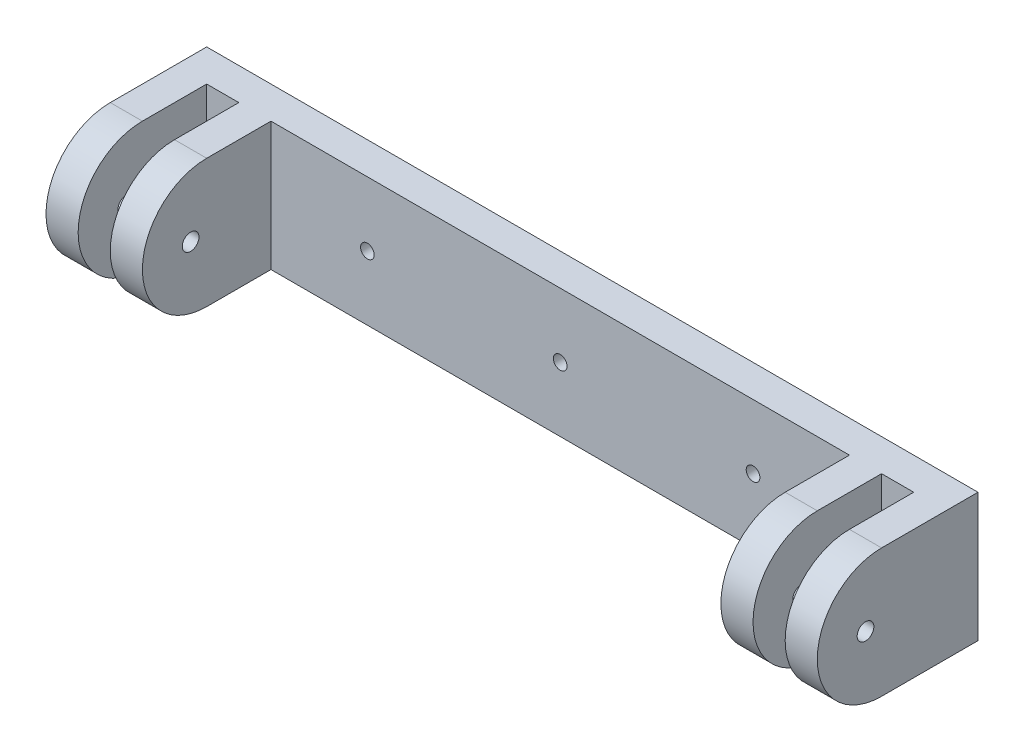
ISO-10303-21;
HEADER;
FILE_DESCRIPTION(('STEP AP214'),'2;1');
FILE_NAME('part.step','',(''),(''),'','','');
FILE_SCHEMA(('AUTOMOTIVE_DESIGN { 1 0 10303 214 1 1 1 1 }'));
ENDSEC;
DATA;
#1=APPLICATION_CONTEXT('core data for automotive mechanical design processes');
#2=APPLICATION_PROTOCOL_DEFINITION('international standard','automotive_design',2000,#1);
#3=PRODUCT_CONTEXT('',#1,'mechanical');
#4=PRODUCT('Part','Part','',(#3));
#5=PRODUCT_RELATED_PRODUCT_CATEGORY('part','',(#4));
#6=PRODUCT_DEFINITION_FORMATION('','',#4);
#7=PRODUCT_DEFINITION_CONTEXT('part definition',#1,'design');
#8=PRODUCT_DEFINITION('design','',#6,#7);
#9=PRODUCT_DEFINITION_SHAPE('','',#8);
#10=(LENGTH_UNIT() NAMED_UNIT(*) SI_UNIT(.MILLI.,.METRE.));
#11=(NAMED_UNIT(*) PLANE_ANGLE_UNIT() SI_UNIT($,.RADIAN.));
#12=(NAMED_UNIT(*) SI_UNIT($,.STERADIAN.) SOLID_ANGLE_UNIT());
#13=UNCERTAINTY_MEASURE_WITH_UNIT(LENGTH_MEASURE(1.E-05),#10,'distance_accuracy_value','');
#14=(GEOMETRIC_REPRESENTATION_CONTEXT(3) GLOBAL_UNCERTAINTY_ASSIGNED_CONTEXT((#13)) GLOBAL_UNIT_ASSIGNED_CONTEXT((#10,
#11,#12)) REPRESENTATION_CONTEXT('',''));
#15=CARTESIAN_POINT('',(0.,0.,0.));
#16=DIRECTION('',(0.,0.,1.));
#17=DIRECTION('',(1.,0.,0.));
#18=AXIS2_PLACEMENT_3D('',#15,#16,#17);
#19=CARTESIAN_POINT('',(-56.5685424949238,20.,30.));
#20=DIRECTION('',(1.,0.,0.));
#21=DIRECTION('',(0.,0.,-1.));
#22=AXIS2_PLACEMENT_3D('',#19,#20,#21);
#23=CYLINDRICAL_SURFACE('',#22,20.);
#24=CARTESIAN_POINT('',(9.99999999999999,20.,30.));
#25=DIRECTION('',(-1.,0.,0.));
#26=DIRECTION('',(0.,0.,1.));
#27=AXIS2_PLACEMENT_3D('',#24,#25,#26);
#28=CIRCLE('',#27,20.);
#29=CARTESIAN_POINT('',(9.99999999999999,40.,30.));
#30=VERTEX_POINT('',#29);
#31=CARTESIAN_POINT('',(10.,0.,30.));
#32=VERTEX_POINT('',#31);
#33=EDGE_CURVE('E182',#30,#32,#28,.F.);
#34=ORIENTED_EDGE('',*,*,#33,.F.);
#35=DIRECTION('',(1.,0.,0.));
#36=VECTOR('',#35,1.);
#37=CARTESIAN_POINT('',(-56.5685424949238,40.,30.));
#38=LINE('',#37,#36);
#39=CARTESIAN_POINT('',(0.,40.,30.));
#40=VERTEX_POINT('',#39);
#41=EDGE_CURVE('E297',#40,#30,#38,.T.);
#42=ORIENTED_EDGE('',*,*,#41,.F.);
#43=CARTESIAN_POINT('',(0.,20.,30.));
#44=DIRECTION('',(1.,0.,0.));
#45=DIRECTION('',(0.,0.,-1.));
#46=AXIS2_PLACEMENT_3D('',#43,#44,#45);
#47=CIRCLE('',#46,20.);
#48=CARTESIAN_POINT('',(0.,0.,30.));
#49=VERTEX_POINT('',#48);
#50=EDGE_CURVE('E294',#49,#40,#47,.F.);
#51=ORIENTED_EDGE('',*,*,#50,.F.);
#52=DIRECTION('',(1.,0.,0.));
#53=VECTOR('',#52,1.);
#54=CARTESIAN_POINT('',(-56.5685424949238,0.,30.));
#55=LINE('',#54,#53);
#56=EDGE_CURVE('E291',#49,#32,#55,.T.);
#57=ORIENTED_EDGE('',*,*,#56,.T.);
#58=EDGE_LOOP('',(#34,#42,#51,#57));
#59=FACE_BOUND('',#58,.T.);
#60=ADVANCED_FACE('F47',(#59),#23,.T.);
#61=CARTESIAN_POINT('',(20.,20.,30.));
#62=DIRECTION('',(1.,0.,0.));
#63=DIRECTION('',(0.,0.,-1.));
#64=AXIS2_PLACEMENT_3D('',#61,#62,#63);
#65=CIRCLE('',#64,20.);
#66=CARTESIAN_POINT('',(20.,0.,30.));
#67=VERTEX_POINT('',#66);
#68=CARTESIAN_POINT('',(20.,40.,30.));
#69=VERTEX_POINT('',#68);
#70=EDGE_CURVE('E265',#67,#69,#65,.F.);
#71=ORIENTED_EDGE('',*,*,#70,.F.);
#72=CARTESIAN_POINT('',(30.,0.,30.));
#73=VERTEX_POINT('',#72);
#74=EDGE_CURVE('E295',#67,#73,#55,.T.);
#75=ORIENTED_EDGE('',*,*,#74,.T.);
#76=CARTESIAN_POINT('',(30.,20.,30.));
#77=DIRECTION('',(-1.,0.,0.));
#78=DIRECTION('',(0.,0.,1.));
#79=AXIS2_PLACEMENT_3D('',#76,#77,#78);
#80=CIRCLE('',#79,20.);
#81=CARTESIAN_POINT('',(30.,40.,30.));
#82=VERTEX_POINT('',#81);
#83=EDGE_CURVE('E257',#82,#73,#80,.F.);
#84=ORIENTED_EDGE('',*,*,#83,.F.);
#85=EDGE_CURVE('E301',#69,#82,#38,.T.);
#86=ORIENTED_EDGE('',*,*,#85,.F.);
#87=EDGE_LOOP('',(#71,#75,#84,#86));
#88=FACE_BOUND('',#87,.T.);
#89=ADVANCED_FACE('F382',(#88),#23,.T.);
#90=CARTESIAN_POINT('',(210.,20.,30.));
#91=DIRECTION('',(1.,0.,0.));
#92=DIRECTION('',(0.,0.,-1.));
#93=AXIS2_PLACEMENT_3D('',#90,#91,#92);
#94=CIRCLE('',#93,20.);
#95=CARTESIAN_POINT('',(210.,0.,30.));
#96=VERTEX_POINT('',#95);
#97=CARTESIAN_POINT('',(210.,40.,30.));
#98=VERTEX_POINT('',#97);
#99=EDGE_CURVE('E249',#96,#98,#94,.F.);
#100=ORIENTED_EDGE('',*,*,#99,.F.);
#101=CARTESIAN_POINT('',(220.,0.,30.));
#102=VERTEX_POINT('',#101);
#103=EDGE_CURVE('E421',#96,#102,#55,.T.);
#104=ORIENTED_EDGE('',*,*,#103,.T.);
#105=CARTESIAN_POINT('',(220.,20.,30.));
#106=DIRECTION('',(-1.,0.,0.));
#107=DIRECTION('',(0.,0.,1.));
#108=AXIS2_PLACEMENT_3D('',#105,#106,#107);
#109=CIRCLE('',#108,20.);
#110=CARTESIAN_POINT('',(220.,40.,30.));
#111=VERTEX_POINT('',#110);
#112=EDGE_CURVE('E241',#111,#102,#109,.F.);
#113=ORIENTED_EDGE('',*,*,#112,.F.);
#114=EDGE_CURVE('E423',#98,#111,#38,.T.);
#115=ORIENTED_EDGE('',*,*,#114,.F.);
#116=EDGE_LOOP('',(#100,#104,#113,#115));
#117=FACE_BOUND('',#116,.T.);
#118=ADVANCED_FACE('F390',(#117),#23,.T.);
#119=CARTESIAN_POINT('',(-60.,20.,35.));
#120=DIRECTION('',(1.,0.,0.));
#121=DIRECTION('',(0.,0.,-1.));
#122=AXIS2_PLACEMENT_3D('',#119,#120,#121);
#123=CYLINDRICAL_SURFACE('',#122,2.6);
#124=CARTESIAN_POINT('',(9.99999999999999,20.,35.));
#125=DIRECTION('',(-1.,0.,0.));
#126=DIRECTION('',(0.,0.,1.));
#127=AXIS2_PLACEMENT_3D('',#124,#125,#126);
#128=CIRCLE('',#127,2.6);
#129=CARTESIAN_POINT('',(9.99999999999999,20.,37.6));
#130=VERTEX_POINT('',#129);
#131=EDGE_CURVE('E272',#130,#130,#128,.F.);
#132=ORIENTED_EDGE('',*,*,#131,.T.);
#133=EDGE_LOOP('',(#132));
#134=FACE_BOUND('',#133,.T.);
#135=CARTESIAN_POINT('',(0.,20.,35.));
#136=DIRECTION('',(1.,0.,0.));
#137=DIRECTION('',(0.,0.,-1.));
#138=AXIS2_PLACEMENT_3D('',#135,#136,#137);
#139=CIRCLE('',#138,2.6);
#140=CARTESIAN_POINT('',(0.,20.,32.4));
#141=VERTEX_POINT('',#140);
#142=EDGE_CURVE('E282',#141,#141,#139,.T.);
#143=ORIENTED_EDGE('',*,*,#142,.F.);
#144=EDGE_LOOP('',(#143));
#145=FACE_BOUND('',#144,.T.);
#146=ADVANCED_FACE('F404',(#134,#145),#123,.F.);
#147=CARTESIAN_POINT('',(0.,0.,10.));
#148=DIRECTION('',(1.,0.,0.));
#149=DIRECTION('',(0.,0.,-1.));
#150=AXIS2_PLACEMENT_3D('',#147,#148,#149);
#151=PLANE('',#150);
#152=ORIENTED_EDGE('',*,*,#142,.T.);
#153=EDGE_LOOP('',(#152));
#154=FACE_BOUND('',#153,.T.);
#155=DIRECTION('',(0.,-1.,0.));
#156=VECTOR('',#155,1.);
#157=CARTESIAN_POINT('',(0.,0.,0.));
#158=LINE('',#157,#156);
#159=CARTESIAN_POINT('',(0.,40.,0.));
#160=VERTEX_POINT('',#159);
#161=CARTESIAN_POINT('',(0.,0.,0.));
#162=VERTEX_POINT('',#161);
#163=EDGE_CURVE('E305',#160,#162,#158,.T.);
#164=ORIENTED_EDGE('',*,*,#163,.T.);
#165=DIRECTION('',(0.,0.,-1.));
#166=VECTOR('',#165,1.);
#167=CARTESIAN_POINT('',(0.,0.,10.));
#168=LINE('',#167,#166);
#169=EDGE_CURVE('E325',#49,#162,#168,.T.);
#170=ORIENTED_EDGE('',*,*,#169,.F.);
#171=ORIENTED_EDGE('',*,*,#50,.T.);
#172=DIRECTION('',(0.,0.,-1.));
#173=VECTOR('',#172,1.);
#174=CARTESIAN_POINT('',(0.,40.,10.));
#175=LINE('',#174,#173);
#176=EDGE_CURVE('E316',#40,#160,#175,.T.);
#177=ORIENTED_EDGE('',*,*,#176,.T.);
#178=EDGE_LOOP('',(#164,#170,#171,#177));
#179=FACE_BOUND('',#178,.T.);
#180=ADVANCED_FACE('F49',(#154,#179),#151,.F.);
#181=CARTESIAN_POINT('',(0.,0.,10.));
#182=DIRECTION('',(0.,1.,0.));
#183=DIRECTION('',(0.,0.,1.));
#184=AXIS2_PLACEMENT_3D('',#181,#182,#183);
#185=PLANE('',#184);
#186=DIRECTION('',(1.,0.,0.));
#187=VECTOR('',#186,1.);
#188=CARTESIAN_POINT('',(10.,0.,10.));
#189=LINE('',#188,#187);
#190=CARTESIAN_POINT('',(10.,0.,10.));
#191=VERTEX_POINT('',#190);
#192=CARTESIAN_POINT('',(20.,0.,10.));
#193=VERTEX_POINT('',#192);
#194=EDGE_CURVE('E170',#191,#193,#189,.T.);
#195=ORIENTED_EDGE('',*,*,#194,.F.);
#196=DIRECTION('',(0.,0.,-1.));
#197=VECTOR('',#196,1.);
#198=CARTESIAN_POINT('',(10.,0.,10.));
#199=LINE('',#198,#197);
#200=EDGE_CURVE('E180',#32,#191,#199,.T.);
#201=ORIENTED_EDGE('',*,*,#200,.F.);
#202=ORIENTED_EDGE('',*,*,#56,.F.);
#203=ORIENTED_EDGE('',*,*,#169,.T.);
#204=DIRECTION('',(1.,0.,0.));
#205=VECTOR('',#204,1.);
#206=CARTESIAN_POINT('',(0.,0.,0.));
#207=LINE('',#206,#205);
#208=CARTESIAN_POINT('',(240.,0.,0.));
#209=VERTEX_POINT('',#208);
#210=EDGE_CURVE('E309',#162,#209,#207,.T.);
#211=ORIENTED_EDGE('',*,*,#210,.T.);
#212=DIRECTION('',(0.,0.,-1.));
#213=VECTOR('',#212,1.);
#214=CARTESIAN_POINT('',(240.,0.,10.));
#215=LINE('',#214,#213);
#216=CARTESIAN_POINT('',(240.,0.,30.));
#217=VERTEX_POINT('',#216);
#218=EDGE_CURVE('E322',#217,#209,#215,.T.);
#219=ORIENTED_EDGE('',*,*,#218,.F.);
#220=CARTESIAN_POINT('',(230.,0.,30.));
#221=VERTEX_POINT('',#220);
#222=EDGE_CURVE('E296',#221,#217,#55,.T.);
#223=ORIENTED_EDGE('',*,*,#222,.F.);
#224=DIRECTION('',(0.,0.,1.));
#225=VECTOR('',#224,1.);
#226=CARTESIAN_POINT('',(230.,0.,50.));
#227=LINE('',#226,#225);
#228=CARTESIAN_POINT('',(230.,0.,10.));
#229=VERTEX_POINT('',#228);
#230=EDGE_CURVE('E220',#229,#221,#227,.T.);
#231=ORIENTED_EDGE('',*,*,#230,.F.);
#232=DIRECTION('',(1.,0.,0.));
#233=VECTOR('',#232,1.);
#234=CARTESIAN_POINT('',(220.,0.,10.));
#235=LINE('',#234,#233);
#236=CARTESIAN_POINT('',(220.,0.,10.));
#237=VERTEX_POINT('',#236);
#238=EDGE_CURVE('E226',#237,#229,#235,.T.);
#239=ORIENTED_EDGE('',*,*,#238,.F.);
#240=DIRECTION('',(0.,0.,-1.));
#241=VECTOR('',#240,1.);
#242=CARTESIAN_POINT('',(220.,0.,50.));
#243=LINE('',#242,#241);
#244=EDGE_CURVE('E207',#102,#237,#243,.T.);
#245=ORIENTED_EDGE('',*,*,#244,.F.);
#246=ORIENTED_EDGE('',*,*,#103,.F.);
#247=DIRECTION('',(0.,0.,1.));
#248=VECTOR('',#247,1.);
#249=CARTESIAN_POINT('',(210.,0.,50.));
#250=LINE('',#249,#248);
#251=CARTESIAN_POINT('',(210.,0.,10.));
#252=VERTEX_POINT('',#251);
#253=EDGE_CURVE('E203',#252,#96,#250,.T.);
#254=ORIENTED_EDGE('',*,*,#253,.F.);
#255=DIRECTION('',(1.,0.,0.));
#256=VECTOR('',#255,1.);
#257=CARTESIAN_POINT('',(30.,0.,10.));
#258=LINE('',#257,#256);
#259=CARTESIAN_POINT('',(30.,0.,10.));
#260=VERTEX_POINT('',#259);
#261=EDGE_CURVE('E210',#260,#252,#258,.T.);
#262=ORIENTED_EDGE('',*,*,#261,.F.);
#263=DIRECTION('',(0.,0.,-1.));
#264=VECTOR('',#263,1.);
#265=CARTESIAN_POINT('',(30.,0.,50.));
#266=LINE('',#265,#264);
#267=EDGE_CURVE('E187',#73,#260,#266,.T.);
#268=ORIENTED_EDGE('',*,*,#267,.F.);
#269=ORIENTED_EDGE('',*,*,#74,.F.);
#270=DIRECTION('',(0.,0.,1.));
#271=VECTOR('',#270,1.);
#272=CARTESIAN_POINT('',(20.,0.,10.));
#273=LINE('',#272,#271);
#274=EDGE_CURVE('E177',#193,#67,#273,.T.);
#275=ORIENTED_EDGE('',*,*,#274,.F.);
#276=EDGE_LOOP('',(#195,#201,#202,#203,#211,#219,#223,#231,#239,#245,#246,#254,#262,#268,#269,#275));
#277=FACE_BOUND('',#276,.T.);
#278=ADVANCED_FACE('F189',(#277),#185,.F.);
#279=CARTESIAN_POINT('',(240.,0.,10.));
#280=DIRECTION('',(-1.,0.,0.));
#281=DIRECTION('',(0.,0.,1.));
#282=AXIS2_PLACEMENT_3D('',#279,#280,#281);
#283=PLANE('',#282);
#284=CARTESIAN_POINT('',(240.,20.,35.));
#285=DIRECTION('',(1.,0.,0.));
#286=DIRECTION('',(0.,0.,-1.));
#287=AXIS2_PLACEMENT_3D('',#284,#285,#286);
#288=CIRCLE('',#287,2.6);
#289=CARTESIAN_POINT('',(240.,20.,32.4));
#290=VERTEX_POINT('',#289);
#291=EDGE_CURVE('E278',#290,#290,#288,.T.);
#292=ORIENTED_EDGE('',*,*,#291,.F.);
#293=EDGE_LOOP('',(#292));
#294=FACE_BOUND('',#293,.T.);
#295=DIRECTION('',(0.,1.,0.));
#296=VECTOR('',#295,1.);
#297=CARTESIAN_POINT('',(240.,0.,0.));
#298=LINE('',#297,#296);
#299=CARTESIAN_POINT('',(240.,40.,0.));
#300=VERTEX_POINT('',#299);
#301=EDGE_CURVE('E73',#209,#300,#298,.T.);
#302=ORIENTED_EDGE('',*,*,#301,.T.);
#303=DIRECTION('',(0.,0.,-1.));
#304=VECTOR('',#303,1.);
#305=CARTESIAN_POINT('',(240.,40.,10.));
#306=LINE('',#305,#304);
#307=CARTESIAN_POINT('',(240.,40.,30.));
#308=VERTEX_POINT('',#307);
#309=EDGE_CURVE('E319',#308,#300,#306,.T.);
#310=ORIENTED_EDGE('',*,*,#309,.F.);
#311=CARTESIAN_POINT('',(240.,20.,30.));
#312=DIRECTION('',(1.,0.,0.));
#313=DIRECTION('',(0.,0.,-1.));
#314=AXIS2_PLACEMENT_3D('',#311,#312,#313);
#315=CIRCLE('',#314,20.);
#316=EDGE_CURVE('E286',#308,#217,#315,.T.);
#317=ORIENTED_EDGE('',*,*,#316,.T.);
#318=ORIENTED_EDGE('',*,*,#218,.T.);
#319=EDGE_LOOP('',(#302,#310,#317,#318));
#320=FACE_BOUND('',#319,.T.);
#321=ADVANCED_FACE('F438',(#294,#320),#283,.F.);
#322=CARTESIAN_POINT('',(0.,40.,10.));
#323=DIRECTION('',(0.,-1.,0.));
#324=DIRECTION('',(0.,0.,-1.));
#325=AXIS2_PLACEMENT_3D('',#322,#323,#324);
#326=PLANE('',#325);
#327=ORIENTED_EDGE('',*,*,#41,.T.);
#328=DIRECTION('',(0.,0.,-1.));
#329=VECTOR('',#328,1.);
#330=CARTESIAN_POINT('',(10.,40.,10.));
#331=LINE('',#330,#329);
#332=CARTESIAN_POINT('',(10.,40.,10.));
#333=VERTEX_POINT('',#332);
#334=EDGE_CURVE('E275',#30,#333,#331,.T.);
#335=ORIENTED_EDGE('',*,*,#334,.T.);
#336=DIRECTION('',(1.,0.,0.));
#337=VECTOR('',#336,1.);
#338=CARTESIAN_POINT('',(0.,40.,10.));
#339=LINE('',#338,#337);
#340=CARTESIAN_POINT('',(20.,40.,10.));
#341=VERTEX_POINT('',#340);
#342=EDGE_CURVE('E11',#333,#341,#339,.T.);
#343=ORIENTED_EDGE('',*,*,#342,.T.);
#344=DIRECTION('',(0.,0.,1.));
#345=VECTOR('',#344,1.);
#346=CARTESIAN_POINT('',(20.,40.,10.));
#347=LINE('',#346,#345);
#348=EDGE_CURVE('E268',#341,#69,#347,.T.);
#349=ORIENTED_EDGE('',*,*,#348,.T.);
#350=ORIENTED_EDGE('',*,*,#85,.T.);
#351=DIRECTION('',(0.,0.,-1.));
#352=VECTOR('',#351,1.);
#353=CARTESIAN_POINT('',(30.,40.,10.));
#354=LINE('',#353,#352);
#355=CARTESIAN_POINT('',(30.,40.,10.));
#356=VERTEX_POINT('',#355);
#357=EDGE_CURVE('E260',#82,#356,#354,.T.);
#358=ORIENTED_EDGE('',*,*,#357,.T.);
#359=DIRECTION('',(1.,0.,0.));
#360=VECTOR('',#359,1.);
#361=CARTESIAN_POINT('',(0.,40.,10.));
#362=LINE('',#361,#360);
#363=CARTESIAN_POINT('',(210.,40.,10.));
#364=VERTEX_POINT('',#363);
#365=EDGE_CURVE('E57',#356,#364,#362,.T.);
#366=ORIENTED_EDGE('',*,*,#365,.T.);
#367=DIRECTION('',(0.,0.,1.));
#368=VECTOR('',#367,1.);
#369=CARTESIAN_POINT('',(210.,40.,10.));
#370=LINE('',#369,#368);
#371=EDGE_CURVE('E252',#364,#98,#370,.T.);
#372=ORIENTED_EDGE('',*,*,#371,.T.);
#373=ORIENTED_EDGE('',*,*,#114,.T.);
#374=DIRECTION('',(0.,0.,-1.));
#375=VECTOR('',#374,1.);
#376=CARTESIAN_POINT('',(220.,40.,10.));
#377=LINE('',#376,#375);
#378=CARTESIAN_POINT('',(220.,40.,10.));
#379=VERTEX_POINT('',#378);
#380=EDGE_CURVE('E244',#111,#379,#377,.T.);
#381=ORIENTED_EDGE('',*,*,#380,.T.);
#382=DIRECTION('',(1.,0.,0.));
#383=VECTOR('',#382,1.);
#384=CARTESIAN_POINT('',(0.,40.,10.));
#385=LINE('',#384,#383);
#386=CARTESIAN_POINT('',(230.,40.,10.));
#387=VERTEX_POINT('',#386);
#388=EDGE_CURVE('E329',#379,#387,#385,.T.);
#389=ORIENTED_EDGE('',*,*,#388,.T.);
#390=DIRECTION('',(0.,0.,1.));
#391=VECTOR('',#390,1.);
#392=CARTESIAN_POINT('',(230.,40.,10.));
#393=LINE('',#392,#391);
#394=CARTESIAN_POINT('',(230.,40.,30.));
#395=VERTEX_POINT('',#394);
#396=EDGE_CURVE('E236',#387,#395,#393,.T.);
#397=ORIENTED_EDGE('',*,*,#396,.T.);
#398=EDGE_CURVE('E290',#395,#308,#38,.T.);
#399=ORIENTED_EDGE('',*,*,#398,.T.);
#400=ORIENTED_EDGE('',*,*,#309,.T.);
#401=DIRECTION('',(-1.,0.,0.));
#402=VECTOR('',#401,1.);
#403=CARTESIAN_POINT('',(0.,40.,0.));
#404=LINE('',#403,#402);
#405=EDGE_CURVE('E65',#300,#160,#404,.T.);
#406=ORIENTED_EDGE('',*,*,#405,.T.);
#407=ORIENTED_EDGE('',*,*,#176,.F.);
#408=EDGE_LOOP('',(#327,#335,#343,#349,#350,#358,#366,#372,#373,#381,#389,#397,#399,#400,#406,#407));
#409=FACE_BOUND('',#408,.T.);
#410=ADVANCED_FACE('F407',(#409),#326,.F.);
#411=CARTESIAN_POINT('',(0.,0.,0.));
#412=DIRECTION('',(0.,0.,-1.));
#413=DIRECTION('',(-1.,0.,0.));
#414=AXIS2_PLACEMENT_3D('',#411,#412,#413);
#415=PLANE('',#414);
#416=CARTESIAN_POINT('',(180.,20.,0.));
#417=DIRECTION('',(0.,0.,-1.));
#418=DIRECTION('',(-1.,0.,0.));
#419=AXIS2_PLACEMENT_3D('',#416,#417,#418);
#420=CIRCLE('',#419,2.12499999999998);
#421=CARTESIAN_POINT('',(177.875,20.,0.));
#422=VERTEX_POINT('',#421);
#423=EDGE_CURVE('E358',#422,#422,#420,.T.);
#424=ORIENTED_EDGE('',*,*,#423,.F.);
#425=EDGE_LOOP('',(#424));
#426=FACE_BOUND('',#425,.T.);
#427=CARTESIAN_POINT('',(120.,20.,0.));
#428=DIRECTION('',(0.,0.,-1.));
#429=DIRECTION('',(-1.,0.,0.));
#430=AXIS2_PLACEMENT_3D('',#427,#428,#429);
#431=CIRCLE('',#430,2.12499999999997);
#432=CARTESIAN_POINT('',(117.875,20.,0.));
#433=VERTEX_POINT('',#432);
#434=EDGE_CURVE('E668',#433,#433,#431,.T.);
#435=ORIENTED_EDGE('',*,*,#434,.F.);
#436=EDGE_LOOP('',(#435));
#437=FACE_BOUND('',#436,.T.);
#438=CARTESIAN_POINT('',(60.,20.,0.));
#439=DIRECTION('',(0.,0.,-1.));
#440=DIRECTION('',(-1.,0.,0.));
#441=AXIS2_PLACEMENT_3D('',#438,#439,#440);
#442=CIRCLE('',#441,2.125);
#443=CARTESIAN_POINT('',(57.875,20.,0.));
#444=VERTEX_POINT('',#443);
#445=EDGE_CURVE('E663',#444,#444,#442,.T.);
#446=ORIENTED_EDGE('',*,*,#445,.F.);
#447=EDGE_LOOP('',(#446));
#448=FACE_BOUND('',#447,.T.);
#449=ORIENTED_EDGE('',*,*,#163,.F.);
#450=ORIENTED_EDGE('',*,*,#405,.F.);
#451=ORIENTED_EDGE('',*,*,#301,.F.);
#452=ORIENTED_EDGE('',*,*,#210,.F.);
#453=EDGE_LOOP('',(#449,#450,#451,#452));
#454=FACE_BOUND('',#453,.T.);
#455=ADVANCED_FACE('F396',(#426,#437,#448,#454),#415,.T.);
#456=CARTESIAN_POINT('',(230.,20.,30.));
#457=DIRECTION('',(1.,0.,0.));
#458=DIRECTION('',(0.,0.,-1.));
#459=AXIS2_PLACEMENT_3D('',#456,#457,#458);
#460=CIRCLE('',#459,20.);
#461=EDGE_CURVE('E233',#221,#395,#460,.F.);
#462=ORIENTED_EDGE('',*,*,#461,.F.);
#463=ORIENTED_EDGE('',*,*,#222,.T.);
#464=ORIENTED_EDGE('',*,*,#316,.F.);
#465=ORIENTED_EDGE('',*,*,#398,.F.);
#466=EDGE_LOOP('',(#462,#463,#464,#465));
#467=FACE_BOUND('',#466,.T.);
#468=ADVANCED_FACE('F385',(#467),#23,.T.);
#469=CARTESIAN_POINT('',(230.,20.,35.));
#470=DIRECTION('',(1.,0.,0.));
#471=DIRECTION('',(0.,0.,-1.));
#472=AXIS2_PLACEMENT_3D('',#469,#470,#471);
#473=CIRCLE('',#472,2.6);
#474=CARTESIAN_POINT('',(230.,20.,32.4));
#475=VERTEX_POINT('',#474);
#476=EDGE_CURVE('E198',#475,#475,#473,.F.);
#477=ORIENTED_EDGE('',*,*,#476,.T.);
#478=EDGE_LOOP('',(#477));
#479=FACE_BOUND('',#478,.T.);
#480=ORIENTED_EDGE('',*,*,#291,.T.);
#481=EDGE_LOOP('',(#480));
#482=FACE_BOUND('',#481,.T.);
#483=ADVANCED_FACE('F395',(#479,#482),#123,.F.);
#484=CARTESIAN_POINT('',(220.,300.,10.));
#485=DIRECTION('',(0.,0.,-1.));
#486=DIRECTION('',(-1.,0.,0.));
#487=AXIS2_PLACEMENT_3D('',#484,#485,#486);
#488=PLANE('',#487);
#489=DIRECTION('',(0.,-1.,0.));
#490=VECTOR('',#489,1.);
#491=CARTESIAN_POINT('',(220.,300.,10.));
#492=LINE('',#491,#490);
#493=EDGE_CURVE('E217',#379,#237,#492,.T.);
#494=ORIENTED_EDGE('',*,*,#493,.T.);
#495=ORIENTED_EDGE('',*,*,#238,.T.);
#496=DIRECTION('',(0.,-1.,0.));
#497=VECTOR('',#496,1.);
#498=CARTESIAN_POINT('',(230.,300.,10.));
#499=LINE('',#498,#497);
#500=EDGE_CURVE('E221',#387,#229,#499,.T.);
#501=ORIENTED_EDGE('',*,*,#500,.F.);
#502=ORIENTED_EDGE('',*,*,#388,.F.);
#503=EDGE_LOOP('',(#494,#495,#501,#502));
#504=FACE_BOUND('',#503,.T.);
#505=ADVANCED_FACE('F402',(#504),#488,.F.);
#506=CARTESIAN_POINT('',(220.,300.,50.));
#507=DIRECTION('',(-1.,0.,0.));
#508=DIRECTION('',(0.,0.,1.));
#509=AXIS2_PLACEMENT_3D('',#506,#507,#508);
#510=PLANE('',#509);
#511=CARTESIAN_POINT('',(220.,20.,35.));
#512=DIRECTION('',(-1.,0.,0.));
#513=DIRECTION('',(0.,0.,1.));
#514=AXIS2_PLACEMENT_3D('',#511,#512,#513);
#515=CIRCLE('',#514,2.6);
#516=CARTESIAN_POINT('',(220.,20.,37.6));
#517=VERTEX_POINT('',#516);
#518=EDGE_CURVE('E240',#517,#517,#515,.F.);
#519=ORIENTED_EDGE('',*,*,#518,.F.);
#520=EDGE_LOOP('',(#519));
#521=FACE_BOUND('',#520,.T.);
#522=ORIENTED_EDGE('',*,*,#380,.F.);
#523=ORIENTED_EDGE('',*,*,#112,.T.);
#524=ORIENTED_EDGE('',*,*,#244,.T.);
#525=ORIENTED_EDGE('',*,*,#493,.F.);
#526=EDGE_LOOP('',(#522,#523,#524,#525));
#527=FACE_BOUND('',#526,.T.);
#528=ADVANCED_FACE('F475',(#521,#527),#510,.F.);
#529=CARTESIAN_POINT('',(230.,300.,50.));
#530=DIRECTION('',(1.,0.,0.));
#531=DIRECTION('',(0.,0.,-1.));
#532=AXIS2_PLACEMENT_3D('',#529,#530,#531);
#533=PLANE('',#532);
#534=ORIENTED_EDGE('',*,*,#476,.F.);
#535=EDGE_LOOP('',(#534));
#536=FACE_BOUND('',#535,.T.);
#537=ORIENTED_EDGE('',*,*,#500,.T.);
#538=ORIENTED_EDGE('',*,*,#230,.T.);
#539=ORIENTED_EDGE('',*,*,#461,.T.);
#540=ORIENTED_EDGE('',*,*,#396,.F.);
#541=EDGE_LOOP('',(#537,#538,#539,#540));
#542=FACE_BOUND('',#541,.T.);
#543=ADVANCED_FACE('F478',(#536,#542),#533,.F.);
#544=CARTESIAN_POINT('',(210.,20.,35.));
#545=DIRECTION('',(1.,0.,0.));
#546=DIRECTION('',(0.,0.,-1.));
#547=AXIS2_PLACEMENT_3D('',#544,#545,#546);
#548=CIRCLE('',#547,2.6);
#549=CARTESIAN_POINT('',(210.,20.,32.4));
#550=VERTEX_POINT('',#549);
#551=EDGE_CURVE('E248',#550,#550,#548,.F.);
#552=ORIENTED_EDGE('',*,*,#551,.T.);
#553=EDGE_LOOP('',(#552));
#554=FACE_BOUND('',#553,.T.);
#555=ORIENTED_EDGE('',*,*,#518,.T.);
#556=EDGE_LOOP('',(#555));
#557=FACE_BOUND('',#556,.T.);
#558=ADVANCED_FACE('F405',(#554,#557),#123,.F.);
#559=CARTESIAN_POINT('',(30.,300.,10.));
#560=DIRECTION('',(0.,0.,-1.));
#561=DIRECTION('',(-1.,0.,0.));
#562=AXIS2_PLACEMENT_3D('',#559,#560,#561);
#563=PLANE('',#562);
#564=CARTESIAN_POINT('',(180.,20.,10.));
#565=DIRECTION('',(0.,0.,-1.));
#566=DIRECTION('',(-1.,0.,0.));
#567=AXIS2_PLACEMENT_3D('',#564,#565,#566);
#568=CIRCLE('',#567,2.12499999999998);
#569=CARTESIAN_POINT('',(177.875,20.,10.));
#570=VERTEX_POINT('',#569);
#571=EDGE_CURVE('E51',#570,#570,#568,.T.);
#572=ORIENTED_EDGE('',*,*,#571,.T.);
#573=EDGE_LOOP('',(#572));
#574=FACE_BOUND('',#573,.T.);
#575=CARTESIAN_POINT('',(120.,20.,10.));
#576=DIRECTION('',(0.,0.,-1.));
#577=DIRECTION('',(-1.,0.,0.));
#578=AXIS2_PLACEMENT_3D('',#575,#576,#577);
#579=CIRCLE('',#578,2.12499999999997);
#580=CARTESIAN_POINT('',(117.875,20.,10.));
#581=VERTEX_POINT('',#580);
#582=EDGE_CURVE('E357',#581,#581,#579,.T.);
#583=ORIENTED_EDGE('',*,*,#582,.T.);
#584=EDGE_LOOP('',(#583));
#585=FACE_BOUND('',#584,.T.);
#586=CARTESIAN_POINT('',(60.,20.,10.));
#587=DIRECTION('',(0.,0.,-1.));
#588=DIRECTION('',(-1.,0.,0.));
#589=AXIS2_PLACEMENT_3D('',#586,#587,#588);
#590=CIRCLE('',#589,2.125);
#591=CARTESIAN_POINT('',(57.875,20.,10.));
#592=VERTEX_POINT('',#591);
#593=EDGE_CURVE('E354',#592,#592,#590,.T.);
#594=ORIENTED_EDGE('',*,*,#593,.T.);
#595=EDGE_LOOP('',(#594));
#596=FACE_BOUND('',#595,.T.);
#597=DIRECTION('',(0.,-1.,0.));
#598=VECTOR('',#597,1.);
#599=CARTESIAN_POINT('',(30.,300.,10.));
#600=LINE('',#599,#598);
#601=EDGE_CURVE('E200',#356,#260,#600,.T.);
#602=ORIENTED_EDGE('',*,*,#601,.T.);
#603=ORIENTED_EDGE('',*,*,#261,.T.);
#604=DIRECTION('',(0.,-1.,0.));
#605=VECTOR('',#604,1.);
#606=CARTESIAN_POINT('',(210.,300.,10.));
#607=LINE('',#606,#605);
#608=EDGE_CURVE('E204',#364,#252,#607,.T.);
#609=ORIENTED_EDGE('',*,*,#608,.F.);
#610=ORIENTED_EDGE('',*,*,#365,.F.);
#611=EDGE_LOOP('',(#602,#603,#609,#610));
#612=FACE_BOUND('',#611,.T.);
#613=ADVANCED_FACE('F367',(#574,#585,#596,#612),#563,.F.);
#614=CARTESIAN_POINT('',(30.,300.,50.));
#615=DIRECTION('',(-1.,0.,0.));
#616=DIRECTION('',(0.,0.,1.));
#617=AXIS2_PLACEMENT_3D('',#614,#615,#616);
#618=PLANE('',#617);
#619=CARTESIAN_POINT('',(30.,20.,35.));
#620=DIRECTION('',(-1.,0.,0.));
#621=DIRECTION('',(0.,0.,1.));
#622=AXIS2_PLACEMENT_3D('',#619,#620,#621);
#623=CIRCLE('',#622,2.6);
#624=CARTESIAN_POINT('',(30.,20.,37.6));
#625=VERTEX_POINT('',#624);
#626=EDGE_CURVE('E256',#625,#625,#623,.F.);
#627=ORIENTED_EDGE('',*,*,#626,.F.);
#628=EDGE_LOOP('',(#627));
#629=FACE_BOUND('',#628,.T.);
#630=ORIENTED_EDGE('',*,*,#357,.F.);
#631=ORIENTED_EDGE('',*,*,#83,.T.);
#632=ORIENTED_EDGE('',*,*,#267,.T.);
#633=ORIENTED_EDGE('',*,*,#601,.F.);
#634=EDGE_LOOP('',(#630,#631,#632,#633));
#635=FACE_BOUND('',#634,.T.);
#636=ADVANCED_FACE('F459',(#629,#635),#618,.F.);
#637=CARTESIAN_POINT('',(210.,300.,50.));
#638=DIRECTION('',(1.,0.,0.));
#639=DIRECTION('',(0.,0.,-1.));
#640=AXIS2_PLACEMENT_3D('',#637,#638,#639);
#641=PLANE('',#640);
#642=ORIENTED_EDGE('',*,*,#551,.F.);
#643=EDGE_LOOP('',(#642));
#644=FACE_BOUND('',#643,.T.);
#645=ORIENTED_EDGE('',*,*,#608,.T.);
#646=ORIENTED_EDGE('',*,*,#253,.T.);
#647=ORIENTED_EDGE('',*,*,#99,.T.);
#648=ORIENTED_EDGE('',*,*,#371,.F.);
#649=EDGE_LOOP('',(#645,#646,#647,#648));
#650=FACE_BOUND('',#649,.T.);
#651=ADVANCED_FACE('F454',(#644,#650),#641,.F.);
#652=CARTESIAN_POINT('',(20.,20.,35.));
#653=DIRECTION('',(1.,0.,0.));
#654=DIRECTION('',(0.,0.,-1.));
#655=AXIS2_PLACEMENT_3D('',#652,#653,#654);
#656=CIRCLE('',#655,2.6);
#657=CARTESIAN_POINT('',(20.,20.,32.4));
#658=VERTEX_POINT('',#657);
#659=EDGE_CURVE('E264',#658,#658,#656,.F.);
#660=ORIENTED_EDGE('',*,*,#659,.T.);
#661=EDGE_LOOP('',(#660));
#662=FACE_BOUND('',#661,.T.);
#663=ORIENTED_EDGE('',*,*,#626,.T.);
#664=EDGE_LOOP('',(#663));
#665=FACE_BOUND('',#664,.T.);
#666=ADVANCED_FACE('F416',(#662,#665),#123,.F.);
#667=CARTESIAN_POINT('',(10.,300.,10.));
#668=DIRECTION('',(0.,0.,-1.));
#669=DIRECTION('',(-1.,0.,0.));
#670=AXIS2_PLACEMENT_3D('',#667,#668,#669);
#671=PLANE('',#670);
#672=DIRECTION('',(0.,-1.,0.));
#673=VECTOR('',#672,1.);
#674=CARTESIAN_POINT('',(10.,300.,10.));
#675=LINE('',#674,#673);
#676=EDGE_CURVE('E165',#333,#191,#675,.T.);
#677=ORIENTED_EDGE('',*,*,#676,.T.);
#678=ORIENTED_EDGE('',*,*,#194,.T.);
#679=DIRECTION('',(0.,-1.,0.));
#680=VECTOR('',#679,1.);
#681=CARTESIAN_POINT('',(20.,300.,10.));
#682=LINE('',#681,#680);
#683=EDGE_CURVE('E176',#341,#193,#682,.T.);
#684=ORIENTED_EDGE('',*,*,#683,.F.);
#685=ORIENTED_EDGE('',*,*,#342,.F.);
#686=EDGE_LOOP('',(#677,#678,#684,#685));
#687=FACE_BOUND('',#686,.T.);
#688=ADVANCED_FACE('F167',(#687),#671,.F.);
#689=CARTESIAN_POINT('',(10.,300.,10.));
#690=DIRECTION('',(-1.,0.,0.));
#691=DIRECTION('',(0.,0.,1.));
#692=AXIS2_PLACEMENT_3D('',#689,#690,#691);
#693=PLANE('',#692);
#694=ORIENTED_EDGE('',*,*,#131,.F.);
#695=EDGE_LOOP('',(#694));
#696=FACE_BOUND('',#695,.T.);
#697=ORIENTED_EDGE('',*,*,#334,.F.);
#698=ORIENTED_EDGE('',*,*,#33,.T.);
#699=ORIENTED_EDGE('',*,*,#200,.T.);
#700=ORIENTED_EDGE('',*,*,#676,.F.);
#701=EDGE_LOOP('',(#697,#698,#699,#700));
#702=FACE_BOUND('',#701,.T.);
#703=ADVANCED_FACE('F181',(#696,#702),#693,.F.);
#704=CARTESIAN_POINT('',(20.,300.,10.));
#705=DIRECTION('',(1.,0.,0.));
#706=DIRECTION('',(0.,0.,-1.));
#707=AXIS2_PLACEMENT_3D('',#704,#705,#706);
#708=PLANE('',#707);
#709=ORIENTED_EDGE('',*,*,#659,.F.);
#710=EDGE_LOOP('',(#709));
#711=FACE_BOUND('',#710,.T.);
#712=ORIENTED_EDGE('',*,*,#683,.T.);
#713=ORIENTED_EDGE('',*,*,#274,.T.);
#714=ORIENTED_EDGE('',*,*,#70,.T.);
#715=ORIENTED_EDGE('',*,*,#348,.F.);
#716=EDGE_LOOP('',(#712,#713,#714,#715));
#717=FACE_BOUND('',#716,.T.);
#718=ADVANCED_FACE('F630',(#711,#717),#708,.F.);
#719=CARTESIAN_POINT('',(60.,20.,300.));
#720=DIRECTION('',(0.,0.,-1.));
#721=DIRECTION('',(-1.,0.,0.));
#722=AXIS2_PLACEMENT_3D('',#719,#720,#721);
#723=CYLINDRICAL_SURFACE('',#722,2.125);
#724=ORIENTED_EDGE('',*,*,#445,.T.);
#725=EDGE_LOOP('',(#724));
#726=FACE_BOUND('',#725,.T.);
#727=ORIENTED_EDGE('',*,*,#593,.F.);
#728=EDGE_LOOP('',(#727));
#729=FACE_BOUND('',#728,.T.);
#730=ADVANCED_FACE('F377',(#726,#729),#723,.F.);
#731=CARTESIAN_POINT('',(120.,20.,300.));
#732=DIRECTION('',(0.,0.,-1.));
#733=DIRECTION('',(-1.,0.,0.));
#734=AXIS2_PLACEMENT_3D('',#731,#732,#733);
#735=CYLINDRICAL_SURFACE('',#734,2.12499999999997);
#736=ORIENTED_EDGE('',*,*,#434,.T.);
#737=EDGE_LOOP('',(#736));
#738=FACE_BOUND('',#737,.T.);
#739=ORIENTED_EDGE('',*,*,#582,.F.);
#740=EDGE_LOOP('',(#739));
#741=FACE_BOUND('',#740,.T.);
#742=ADVANCED_FACE('F371',(#738,#741),#735,.F.);
#743=CARTESIAN_POINT('',(180.,20.,300.));
#744=DIRECTION('',(0.,0.,-1.));
#745=DIRECTION('',(-1.,0.,0.));
#746=AXIS2_PLACEMENT_3D('',#743,#744,#745);
#747=CYLINDRICAL_SURFACE('',#746,2.12499999999998);
#748=ORIENTED_EDGE('',*,*,#423,.T.);
#749=EDGE_LOOP('',(#748));
#750=FACE_BOUND('',#749,.T.);
#751=ORIENTED_EDGE('',*,*,#571,.F.);
#752=EDGE_LOOP('',(#751));
#753=FACE_BOUND('',#752,.T.);
#754=ADVANCED_FACE('F369',(#750,#753),#747,.F.);
#755=CLOSED_SHELL('',(#60,#89,#118,#146,#180,#278,#321,#410,#455,#468,#483,#505,#528,#543,#558,
#613,#636,#651,#666,#688,#703,#718,#730,#742,#754));
#756=MANIFOLD_SOLID_BREP('B2',#755);
#757=ADVANCED_BREP_SHAPE_REPRESENTATION('',(#18,#756),#14);
#758=SHAPE_DEFINITION_REPRESENTATION(#9,#757);
ENDSEC;
END-ISO-10303-21;
